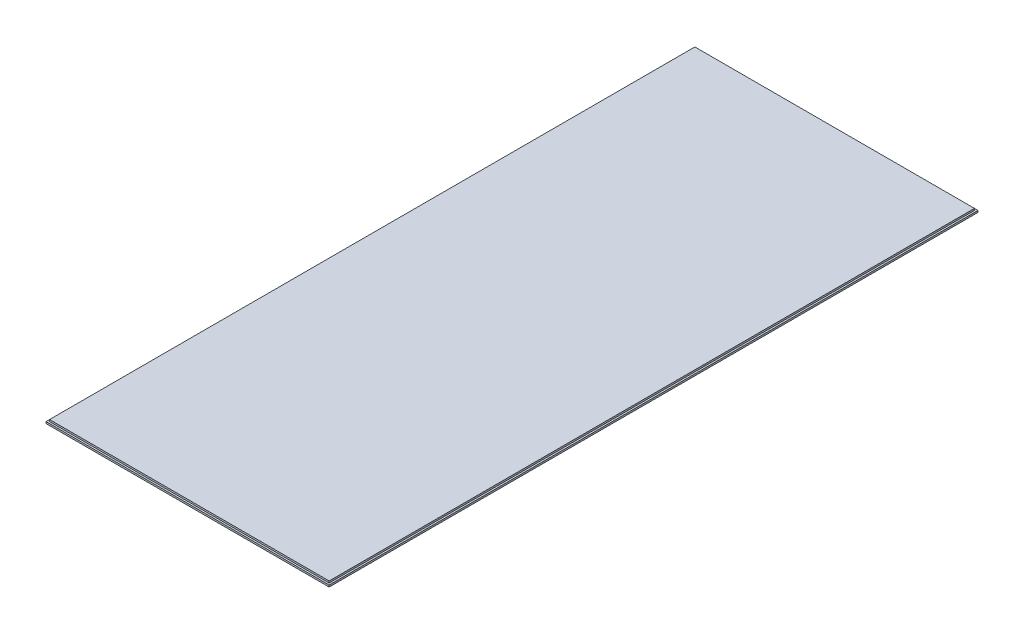
ISO-10303-21;
HEADER;
FILE_DESCRIPTION(('STEP AP214'),'2;1');
FILE_NAME('part.step','',(''),(''),'','','');
FILE_SCHEMA(('AUTOMOTIVE_DESIGN { 1 0 10303 214 1 1 1 1 }'));
ENDSEC;
DATA;
#1=APPLICATION_CONTEXT('core data for automotive mechanical design processes');
#2=APPLICATION_PROTOCOL_DEFINITION('international standard','automotive_design',2000,#1);
#3=PRODUCT_CONTEXT('',#1,'mechanical');
#4=PRODUCT('Part','Part','',(#3));
#5=PRODUCT_RELATED_PRODUCT_CATEGORY('part','',(#4));
#6=PRODUCT_DEFINITION_FORMATION('','',#4);
#7=PRODUCT_DEFINITION_CONTEXT('part definition',#1,'design');
#8=PRODUCT_DEFINITION('design','',#6,#7);
#9=PRODUCT_DEFINITION_SHAPE('','',#8);
#10=(LENGTH_UNIT() NAMED_UNIT(*) SI_UNIT(.MILLI.,.METRE.));
#11=(NAMED_UNIT(*) PLANE_ANGLE_UNIT() SI_UNIT($,.RADIAN.));
#12=(NAMED_UNIT(*) SI_UNIT($,.STERADIAN.) SOLID_ANGLE_UNIT());
#13=UNCERTAINTY_MEASURE_WITH_UNIT(LENGTH_MEASURE(1.E-05),#10,'distance_accuracy_value','');
#14=(GEOMETRIC_REPRESENTATION_CONTEXT(3) GLOBAL_UNCERTAINTY_ASSIGNED_CONTEXT((#13)) GLOBAL_UNIT_ASSIGNED_CONTEXT((#10,
#11,#12)) REPRESENTATION_CONTEXT('',''));
#15=CARTESIAN_POINT('',(0.,0.,0.));
#16=DIRECTION('',(0.,0.,1.));
#17=DIRECTION('',(1.,0.,0.));
#18=AXIS2_PLACEMENT_3D('',#15,#16,#17);
#19=CARTESIAN_POINT('',(0.,1.190625,0.));
#20=DIRECTION('',(0.,-1.,0.));
#21=DIRECTION('',(0.,0.,-1.));
#22=AXIS2_PLACEMENT_3D('',#19,#20,#21);
#23=PLANE('',#22);
#24=DIRECTION('',(0.,0.,1.));
#25=VECTOR('',#24,1.);
#26=CARTESIAN_POINT('',(-59.3361837874985,1.190625,54.2023562758621));
#27=LINE('',#26,#25);
#28=CARTESIAN_POINT('',(-59.3361837874985,1.190625,-382.360143724138));
#29=VERTEX_POINT('',#28);
#30=CARTESIAN_POINT('',(-59.3361837874985,1.190625,54.2023562758621));
#31=VERTEX_POINT('',#30);
#32=EDGE_CURVE('E128',#29,#31,#27,.T.);
#33=ORIENTED_EDGE('',*,*,#32,.T.);
#34=DIRECTION('',(1.,0.,0.));
#35=VECTOR('',#34,1.);
#36=CARTESIAN_POINT('',(-59.3361837874985,1.190625,54.2023562758621));
#37=LINE('',#36,#35);
#38=CARTESIAN_POINT('',(131.163816212502,1.190625,54.2023562758621));
#39=VERTEX_POINT('',#38);
#40=EDGE_CURVE('E131',#31,#39,#37,.T.);
#41=ORIENTED_EDGE('',*,*,#40,.T.);
#42=DIRECTION('',(0.,0.,-1.));
#43=VECTOR('',#42,1.);
#44=CARTESIAN_POINT('',(131.163816212502,1.190625,54.2023562758621));
#45=LINE('',#44,#43);
#46=CARTESIAN_POINT('',(131.163816212502,1.190625,-382.360143724138));
#47=VERTEX_POINT('',#46);
#48=EDGE_CURVE('E134',#39,#47,#45,.T.);
#49=ORIENTED_EDGE('',*,*,#48,.T.);
#50=DIRECTION('',(-1.,0.,0.));
#51=VECTOR('',#50,1.);
#52=CARTESIAN_POINT('',(-59.3361837874985,1.190625,-382.360143724138));
#53=LINE('',#52,#51);
#54=EDGE_CURVE('E136',#47,#29,#53,.T.);
#55=ORIENTED_EDGE('',*,*,#54,.T.);
#56=EDGE_LOOP('',(#33,#41,#49,#55));
#57=FACE_BOUND('',#56,.T.);
#58=DIRECTION('',(0.,0.,1.));
#59=VECTOR('',#58,1.);
#60=CARTESIAN_POINT('',(-58.1455587874985,1.190625,-381.169518724138));
#61=LINE('',#60,#59);
#62=CARTESIAN_POINT('',(-58.1455587874985,1.190625,-381.169518724138));
#63=VERTEX_POINT('',#62);
#64=CARTESIAN_POINT('',(-58.1455587874984,1.190625,53.0117312758621));
#65=VERTEX_POINT('',#64);
#66=EDGE_CURVE('E118',#63,#65,#61,.T.);
#67=ORIENTED_EDGE('',*,*,#66,.F.);
#68=DIRECTION('',(-1.,0.,0.));
#69=VECTOR('',#68,1.);
#70=CARTESIAN_POINT('',(-58.1455587874985,1.190625,-381.169518724138));
#71=LINE('',#70,#69);
#72=CARTESIAN_POINT('',(129.973191212502,1.190625,-381.169518724138));
#73=VERTEX_POINT('',#72);
#74=EDGE_CURVE('E115',#73,#63,#71,.T.);
#75=ORIENTED_EDGE('',*,*,#74,.F.);
#76=DIRECTION('',(0.,0.,-1.));
#77=VECTOR('',#76,1.);
#78=CARTESIAN_POINT('',(129.973191212502,1.190625,-381.169518724138));
#79=LINE('',#78,#77);
#80=CARTESIAN_POINT('',(129.973191212502,1.190625,53.0117312758621));
#81=VERTEX_POINT('',#80);
#82=EDGE_CURVE('E53',#81,#73,#79,.T.);
#83=ORIENTED_EDGE('',*,*,#82,.F.);
#84=DIRECTION('',(1.,0.,0.));
#85=VECTOR('',#84,1.);
#86=CARTESIAN_POINT('',(-58.1455587874984,1.190625,53.0117312758621));
#87=LINE('',#86,#85);
#88=EDGE_CURVE('E48',#65,#81,#87,.T.);
#89=ORIENTED_EDGE('',*,*,#88,.F.);
#90=EDGE_LOOP('',(#67,#75,#83,#89));
#91=FACE_BOUND('',#90,.T.);
#92=ADVANCED_FACE('F33',(#57,#91),#23,.F.);
#93=CARTESIAN_POINT('',(-59.3361837874985,1.190625,54.2023562758621));
#94=DIRECTION('',(1.,0.,0.));
#95=DIRECTION('',(0.,0.,-1.));
#96=AXIS2_PLACEMENT_3D('',#93,#94,#95);
#97=PLANE('',#96);
#98=DIRECTION('',(0.,0.,1.));
#99=VECTOR('',#98,1.);
#100=CARTESIAN_POINT('',(-59.3361837874985,0.,54.2023562758621));
#101=LINE('',#100,#99);
#102=CARTESIAN_POINT('',(-59.3361837874985,0.,-382.360143724138));
#103=VERTEX_POINT('',#102);
#104=CARTESIAN_POINT('',(-59.3361837874985,0.,54.2023562758621));
#105=VERTEX_POINT('',#104);
#106=EDGE_CURVE('E119',#103,#105,#101,.T.);
#107=ORIENTED_EDGE('',*,*,#106,.T.);
#108=DIRECTION('',(0.,-1.,0.));
#109=VECTOR('',#108,1.);
#110=CARTESIAN_POINT('',(-59.3361837874985,1.190625,54.2023562758621));
#111=LINE('',#110,#109);
#112=EDGE_CURVE('E11',#31,#105,#111,.T.);
#113=ORIENTED_EDGE('',*,*,#112,.F.);
#114=ORIENTED_EDGE('',*,*,#32,.F.);
#115=DIRECTION('',(0.,-1.,0.));
#116=VECTOR('',#115,1.);
#117=CARTESIAN_POINT('',(-59.3361837874985,1.190625,-382.360143724138));
#118=LINE('',#117,#116);
#119=EDGE_CURVE('E137',#29,#103,#118,.T.);
#120=ORIENTED_EDGE('',*,*,#119,.T.);
#121=EDGE_LOOP('',(#107,#113,#114,#120));
#122=FACE_BOUND('',#121,.T.);
#123=ADVANCED_FACE('F35',(#122),#97,.F.);
#124=CARTESIAN_POINT('',(-59.3361837874985,1.190625,54.2023562758621));
#125=DIRECTION('',(0.,0.,-1.));
#126=DIRECTION('',(-1.,0.,0.));
#127=AXIS2_PLACEMENT_3D('',#124,#125,#126);
#128=PLANE('',#127);
#129=DIRECTION('',(1.,0.,0.));
#130=VECTOR('',#129,1.);
#131=CARTESIAN_POINT('',(-59.3361837874985,0.,54.2023562758621));
#132=LINE('',#131,#130);
#133=CARTESIAN_POINT('',(131.163816212502,0.,54.2023562758621));
#134=VERTEX_POINT('',#133);
#135=EDGE_CURVE('E122',#105,#134,#132,.T.);
#136=ORIENTED_EDGE('',*,*,#135,.T.);
#137=DIRECTION('',(0.,-1.,0.));
#138=VECTOR('',#137,1.);
#139=CARTESIAN_POINT('',(131.163816212502,1.190625,54.2023562758621));
#140=LINE('',#139,#138);
#141=EDGE_CURVE('E41',#39,#134,#140,.T.);
#142=ORIENTED_EDGE('',*,*,#141,.F.);
#143=ORIENTED_EDGE('',*,*,#40,.F.);
#144=ORIENTED_EDGE('',*,*,#112,.T.);
#145=EDGE_LOOP('',(#136,#142,#143,#144));
#146=FACE_BOUND('',#145,.T.);
#147=ADVANCED_FACE('F167',(#146),#128,.F.);
#148=CARTESIAN_POINT('',(131.163816212502,1.190625,54.2023562758621));
#149=DIRECTION('',(-1.,0.,0.));
#150=DIRECTION('',(0.,0.,1.));
#151=AXIS2_PLACEMENT_3D('',#148,#149,#150);
#152=PLANE('',#151);
#153=DIRECTION('',(0.,0.,-1.));
#154=VECTOR('',#153,1.);
#155=CARTESIAN_POINT('',(131.163816212502,0.,54.2023562758621));
#156=LINE('',#155,#154);
#157=CARTESIAN_POINT('',(131.163816212502,0.,-382.360143724138));
#158=VERTEX_POINT('',#157);
#159=EDGE_CURVE('E140',#134,#158,#156,.T.);
#160=ORIENTED_EDGE('',*,*,#159,.T.);
#161=DIRECTION('',(0.,-1.,0.));
#162=VECTOR('',#161,1.);
#163=CARTESIAN_POINT('',(131.163816212502,1.190625,-382.360143724138));
#164=LINE('',#163,#162);
#165=EDGE_CURVE('E145',#47,#158,#164,.T.);
#166=ORIENTED_EDGE('',*,*,#165,.F.);
#167=ORIENTED_EDGE('',*,*,#48,.F.);
#168=ORIENTED_EDGE('',*,*,#141,.T.);
#169=EDGE_LOOP('',(#160,#166,#167,#168));
#170=FACE_BOUND('',#169,.T.);
#171=ADVANCED_FACE('F152',(#170),#152,.F.);
#172=CARTESIAN_POINT('',(-59.3361837874985,1.190625,-382.360143724138));
#173=DIRECTION('',(0.,0.,1.));
#174=DIRECTION('',(1.,0.,0.));
#175=AXIS2_PLACEMENT_3D('',#172,#173,#174);
#176=PLANE('',#175);
#177=DIRECTION('',(-1.,0.,0.));
#178=VECTOR('',#177,1.);
#179=CARTESIAN_POINT('',(-59.3361837874985,0.,-382.360143724138));
#180=LINE('',#179,#178);
#181=EDGE_CURVE('E132',#158,#103,#180,.T.);
#182=ORIENTED_EDGE('',*,*,#181,.T.);
#183=ORIENTED_EDGE('',*,*,#119,.F.);
#184=ORIENTED_EDGE('',*,*,#54,.F.);
#185=ORIENTED_EDGE('',*,*,#165,.T.);
#186=EDGE_LOOP('',(#182,#183,#184,#185));
#187=FACE_BOUND('',#186,.T.);
#188=ADVANCED_FACE('F161',(#187),#176,.F.);
#189=CARTESIAN_POINT('',(0.,0.,0.));
#190=DIRECTION('',(0.,-1.,0.));
#191=DIRECTION('',(0.,0.,-1.));
#192=AXIS2_PLACEMENT_3D('',#189,#190,#191);
#193=PLANE('',#192);
#194=ORIENTED_EDGE('',*,*,#106,.F.);
#195=ORIENTED_EDGE('',*,*,#181,.F.);
#196=ORIENTED_EDGE('',*,*,#159,.F.);
#197=ORIENTED_EDGE('',*,*,#135,.F.);
#198=EDGE_LOOP('',(#194,#195,#196,#197));
#199=FACE_BOUND('',#198,.T.);
#200=ADVANCED_FACE('F158',(#199),#193,.T.);
#201=CARTESIAN_POINT('',(-58.1455587874985,2.38125,-381.169518724138));
#202=DIRECTION('',(1.,0.,0.));
#203=DIRECTION('',(0.,0.,-1.));
#204=AXIS2_PLACEMENT_3D('',#201,#202,#203);
#205=PLANE('',#204);
#206=ORIENTED_EDGE('',*,*,#66,.T.);
#207=DIRECTION('',(0.,-1.,0.));
#208=VECTOR('',#207,1.);
#209=CARTESIAN_POINT('',(-58.1455587874984,2.38125,53.0117312758621));
#210=LINE('',#209,#208);
#211=CARTESIAN_POINT('',(-58.1455587874984,2.38125,53.0117312758621));
#212=VERTEX_POINT('',#211);
#213=EDGE_CURVE('E99',#212,#65,#210,.T.);
#214=ORIENTED_EDGE('',*,*,#213,.F.);
#215=DIRECTION('',(0.,0.,1.));
#216=VECTOR('',#215,1.);
#217=CARTESIAN_POINT('',(-58.1455587874985,2.38125,-381.169518724138));
#218=LINE('',#217,#216);
#219=CARTESIAN_POINT('',(-58.1455587874985,2.38125,-381.169518724138));
#220=VERTEX_POINT('',#219);
#221=EDGE_CURVE('E106',#220,#212,#218,.T.);
#222=ORIENTED_EDGE('',*,*,#221,.F.);
#223=DIRECTION('',(0.,-1.,0.));
#224=VECTOR('',#223,1.);
#225=CARTESIAN_POINT('',(-58.1455587874985,2.38125,-381.169518724138));
#226=LINE('',#225,#224);
#227=EDGE_CURVE('E260',#220,#63,#226,.T.);
#228=ORIENTED_EDGE('',*,*,#227,.T.);
#229=EDGE_LOOP('',(#206,#214,#222,#228));
#230=FACE_BOUND('',#229,.T.);
#231=ADVANCED_FACE('F117',(#230),#205,.F.);
#232=CARTESIAN_POINT('',(-58.1455587874984,2.38125,53.0117312758621));
#233=DIRECTION('',(0.,0.,-1.));
#234=DIRECTION('',(-1.,0.,0.));
#235=AXIS2_PLACEMENT_3D('',#232,#233,#234);
#236=PLANE('',#235);
#237=ORIENTED_EDGE('',*,*,#88,.T.);
#238=DIRECTION('',(0.,-1.,0.));
#239=VECTOR('',#238,1.);
#240=CARTESIAN_POINT('',(129.973191212502,2.38125,53.0117312758621));
#241=LINE('',#240,#239);
#242=CARTESIAN_POINT('',(129.973191212502,2.38125,53.0117312758621));
#243=VERTEX_POINT('',#242);
#244=EDGE_CURVE('E102',#243,#81,#241,.T.);
#245=ORIENTED_EDGE('',*,*,#244,.F.);
#246=DIRECTION('',(1.,0.,0.));
#247=VECTOR('',#246,1.);
#248=CARTESIAN_POINT('',(-58.1455587874984,2.38125,53.0117312758621));
#249=LINE('',#248,#247);
#250=EDGE_CURVE('E95',#212,#243,#249,.T.);
#251=ORIENTED_EDGE('',*,*,#250,.F.);
#252=ORIENTED_EDGE('',*,*,#213,.T.);
#253=EDGE_LOOP('',(#237,#245,#251,#252));
#254=FACE_BOUND('',#253,.T.);
#255=ADVANCED_FACE('F97',(#254),#236,.F.);
#256=CARTESIAN_POINT('',(129.973191212502,2.38125,-381.169518724138));
#257=DIRECTION('',(-1.,0.,0.));
#258=DIRECTION('',(0.,0.,1.));
#259=AXIS2_PLACEMENT_3D('',#256,#257,#258);
#260=PLANE('',#259);
#261=ORIENTED_EDGE('',*,*,#82,.T.);
#262=DIRECTION('',(0.,-1.,0.));
#263=VECTOR('',#262,1.);
#264=CARTESIAN_POINT('',(129.973191212502,2.38125,-381.169518724138));
#265=LINE('',#264,#263);
#266=CARTESIAN_POINT('',(129.973191212502,2.38125,-381.169518724138));
#267=VERTEX_POINT('',#266);
#268=EDGE_CURVE('E124',#267,#73,#265,.T.);
#269=ORIENTED_EDGE('',*,*,#268,.F.);
#270=DIRECTION('',(0.,0.,-1.));
#271=VECTOR('',#270,1.);
#272=CARTESIAN_POINT('',(129.973191212502,2.38125,-381.169518724138));
#273=LINE('',#272,#271);
#274=EDGE_CURVE('E105',#243,#267,#273,.T.);
#275=ORIENTED_EDGE('',*,*,#274,.F.);
#276=ORIENTED_EDGE('',*,*,#244,.T.);
#277=EDGE_LOOP('',(#261,#269,#275,#276));
#278=FACE_BOUND('',#277,.T.);
#279=ADVANCED_FACE('F203',(#278),#260,.F.);
#280=CARTESIAN_POINT('',(-58.1455587874985,2.38125,-381.169518724138));
#281=DIRECTION('',(0.,0.,1.));
#282=DIRECTION('',(1.,0.,0.));
#283=AXIS2_PLACEMENT_3D('',#280,#281,#282);
#284=PLANE('',#283);
#285=ORIENTED_EDGE('',*,*,#74,.T.);
#286=ORIENTED_EDGE('',*,*,#227,.F.);
#287=DIRECTION('',(-1.,0.,0.));
#288=VECTOR('',#287,1.);
#289=CARTESIAN_POINT('',(-58.1455587874985,2.38125,-381.169518724138));
#290=LINE('',#289,#288);
#291=EDGE_CURVE('E111',#267,#220,#290,.T.);
#292=ORIENTED_EDGE('',*,*,#291,.F.);
#293=ORIENTED_EDGE('',*,*,#268,.T.);
#294=EDGE_LOOP('',(#285,#286,#292,#293));
#295=FACE_BOUND('',#294,.T.);
#296=ADVANCED_FACE('F209',(#295),#284,.F.);
#297=CARTESIAN_POINT('',(0.,2.38125,0.));
#298=DIRECTION('',(0.,1.,0.));
#299=DIRECTION('',(0.,0.,1.));
#300=AXIS2_PLACEMENT_3D('',#297,#298,#299);
#301=PLANE('',#300);
#302=ORIENTED_EDGE('',*,*,#221,.T.);
#303=ORIENTED_EDGE('',*,*,#250,.T.);
#304=ORIENTED_EDGE('',*,*,#274,.T.);
#305=ORIENTED_EDGE('',*,*,#291,.T.);
#306=EDGE_LOOP('',(#302,#303,#304,#305));
#307=FACE_BOUND('',#306,.T.);
#308=ADVANCED_FACE('F109',(#307),#301,.T.);
#309=CLOSED_SHELL('',(#92,#123,#147,#171,#188,#200,#231,#255,#279,#296,#308));
#310=MANIFOLD_SOLID_BREP('B2',#309);
#311=ADVANCED_BREP_SHAPE_REPRESENTATION('',(#18,#310),#14);
#312=SHAPE_DEFINITION_REPRESENTATION(#9,#311);
ENDSEC;
END-ISO-10303-21;
